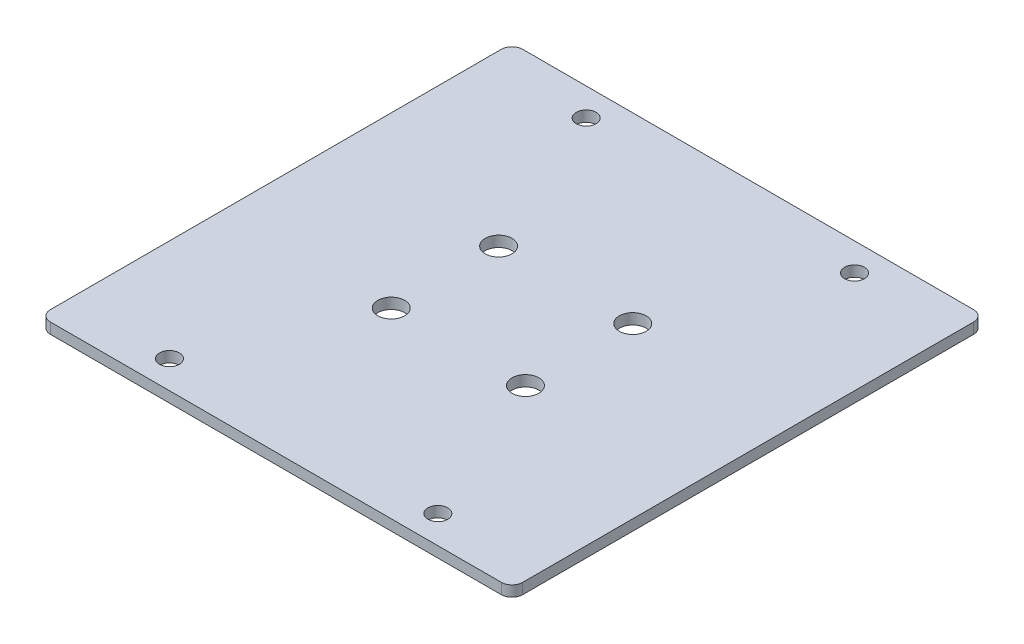
ISO-10303-21;
HEADER;
FILE_DESCRIPTION(('STEP AP214'),'2;1');
FILE_NAME('part.step','',(''),(''),'','','');
FILE_SCHEMA(('AUTOMOTIVE_DESIGN { 1 0 10303 214 1 1 1 1 }'));
ENDSEC;
DATA;
#1=APPLICATION_CONTEXT('core data for automotive mechanical design processes');
#2=APPLICATION_PROTOCOL_DEFINITION('international standard','automotive_design',2000,#1);
#3=PRODUCT_CONTEXT('',#1,'mechanical');
#4=PRODUCT('Part','Part','',(#3));
#5=PRODUCT_RELATED_PRODUCT_CATEGORY('part','',(#4));
#6=PRODUCT_DEFINITION_FORMATION('','',#4);
#7=PRODUCT_DEFINITION_CONTEXT('part definition',#1,'design');
#8=PRODUCT_DEFINITION('design','',#6,#7);
#9=PRODUCT_DEFINITION_SHAPE('','',#8);
#10=(LENGTH_UNIT() NAMED_UNIT(*) SI_UNIT(.MILLI.,.METRE.));
#11=(NAMED_UNIT(*) PLANE_ANGLE_UNIT() SI_UNIT($,.RADIAN.));
#12=(NAMED_UNIT(*) SI_UNIT($,.STERADIAN.) SOLID_ANGLE_UNIT());
#13=UNCERTAINTY_MEASURE_WITH_UNIT(LENGTH_MEASURE(1.E-05),#10,'distance_accuracy_value','');
#14=(GEOMETRIC_REPRESENTATION_CONTEXT(3) GLOBAL_UNCERTAINTY_ASSIGNED_CONTEXT((#13)) GLOBAL_UNIT_ASSIGNED_CONTEXT((#10,
#11,#12)) REPRESENTATION_CONTEXT('',''));
#15=CARTESIAN_POINT('',(0.,0.,0.));
#16=DIRECTION('',(0.,0.,1.));
#17=DIRECTION('',(1.,0.,0.));
#18=AXIS2_PLACEMENT_3D('',#15,#16,#17);
#19=CARTESIAN_POINT('',(-44.,2.,44.));
#20=DIRECTION('',(1.,0.,0.));
#21=DIRECTION('',(0.,0.,-1.));
#22=AXIS2_PLACEMENT_3D('',#19,#20,#21);
#23=PLANE('',#22);
#24=DIRECTION('',(0.,0.,1.));
#25=VECTOR('',#24,1.);
#26=CARTESIAN_POINT('',(-44.,2.,44.));
#27=LINE('',#26,#25);
#28=CARTESIAN_POINT('',(-44.,2.,-42.));
#29=VERTEX_POINT('',#28);
#30=CARTESIAN_POINT('',(-44.,2.,42.));
#31=VERTEX_POINT('',#30);
#32=EDGE_CURVE('E131',#29,#31,#27,.T.);
#33=ORIENTED_EDGE('',*,*,#32,.F.);
#34=DIRECTION('',(0.,-1.,0.));
#35=VECTOR('',#34,1.);
#36=CARTESIAN_POINT('',(-44.,2.,-42.));
#37=LINE('',#36,#35);
#38=CARTESIAN_POINT('',(-44.,0.,-42.));
#39=VERTEX_POINT('',#38);
#40=EDGE_CURVE('E116',#29,#39,#37,.T.);
#41=ORIENTED_EDGE('',*,*,#40,.T.);
#42=DIRECTION('',(0.,0.,1.));
#43=VECTOR('',#42,1.);
#44=CARTESIAN_POINT('',(-44.,0.,44.));
#45=LINE('',#44,#43);
#46=CARTESIAN_POINT('',(-44.,0.,42.));
#47=VERTEX_POINT('',#46);
#48=EDGE_CURVE('E128',#39,#47,#45,.T.);
#49=ORIENTED_EDGE('',*,*,#48,.T.);
#50=DIRECTION('',(0.,-1.,0.));
#51=VECTOR('',#50,1.);
#52=CARTESIAN_POINT('',(-44.,2.,42.));
#53=LINE('',#52,#51);
#54=EDGE_CURVE('E133',#47,#31,#53,.F.);
#55=ORIENTED_EDGE('',*,*,#54,.T.);
#56=EDGE_LOOP('',(#33,#41,#49,#55));
#57=FACE_BOUND('',#56,.T.);
#58=ADVANCED_FACE('F43',(#57),#23,.F.);
#59=CARTESIAN_POINT('',(44.,2.,44.));
#60=DIRECTION('',(0.,0.,-1.));
#61=DIRECTION('',(-1.,0.,0.));
#62=AXIS2_PLACEMENT_3D('',#59,#60,#61);
#63=PLANE('',#62);
#64=DIRECTION('',(1.,0.,0.));
#65=VECTOR('',#64,1.);
#66=CARTESIAN_POINT('',(44.,2.,44.));
#67=LINE('',#66,#65);
#68=CARTESIAN_POINT('',(-42.,2.,44.));
#69=VERTEX_POINT('',#68);
#70=CARTESIAN_POINT('',(42.,2.,44.));
#71=VERTEX_POINT('',#70);
#72=EDGE_CURVE('E212',#69,#71,#67,.T.);
#73=ORIENTED_EDGE('',*,*,#72,.F.);
#74=DIRECTION('',(0.,-1.,0.));
#75=VECTOR('',#74,1.);
#76=CARTESIAN_POINT('',(-42.,2.,44.));
#77=LINE('',#76,#75);
#78=CARTESIAN_POINT('',(-42.,0.,44.));
#79=VERTEX_POINT('',#78);
#80=EDGE_CURVE('E11',#69,#79,#77,.T.);
#81=ORIENTED_EDGE('',*,*,#80,.T.);
#82=DIRECTION('',(1.,0.,0.));
#83=VECTOR('',#82,1.);
#84=CARTESIAN_POINT('',(44.,0.,44.));
#85=LINE('',#84,#83);
#86=CARTESIAN_POINT('',(42.,0.,44.));
#87=VERTEX_POINT('',#86);
#88=EDGE_CURVE('E138',#79,#87,#85,.T.);
#89=ORIENTED_EDGE('',*,*,#88,.T.);
#90=DIRECTION('',(0.,-1.,0.));
#91=VECTOR('',#90,1.);
#92=CARTESIAN_POINT('',(42.,2.,44.));
#93=LINE('',#92,#91);
#94=EDGE_CURVE('E52',#87,#71,#93,.F.);
#95=ORIENTED_EDGE('',*,*,#94,.T.);
#96=EDGE_LOOP('',(#73,#81,#89,#95));
#97=FACE_BOUND('',#96,.T.);
#98=ADVANCED_FACE('F230',(#97),#63,.F.);
#99=CARTESIAN_POINT('',(44.,2.,44.));
#100=DIRECTION('',(-1.,0.,0.));
#101=DIRECTION('',(0.,0.,1.));
#102=AXIS2_PLACEMENT_3D('',#99,#100,#101);
#103=PLANE('',#102);
#104=DIRECTION('',(0.,0.,-1.));
#105=VECTOR('',#104,1.);
#106=CARTESIAN_POINT('',(44.,0.,44.));
#107=LINE('',#106,#105);
#108=CARTESIAN_POINT('',(44.,0.,42.));
#109=VERTEX_POINT('',#108);
#110=CARTESIAN_POINT('',(44.,0.,-42.));
#111=VERTEX_POINT('',#110);
#112=EDGE_CURVE('E142',#109,#111,#107,.T.);
#113=ORIENTED_EDGE('',*,*,#112,.T.);
#114=DIRECTION('',(0.,-1.,0.));
#115=VECTOR('',#114,1.);
#116=CARTESIAN_POINT('',(44.,2.,-42.));
#117=LINE('',#116,#115);
#118=CARTESIAN_POINT('',(44.,2.,-42.));
#119=VERTEX_POINT('',#118);
#120=EDGE_CURVE('E60',#111,#119,#117,.F.);
#121=ORIENTED_EDGE('',*,*,#120,.T.);
#122=DIRECTION('',(0.,0.,-1.));
#123=VECTOR('',#122,1.);
#124=CARTESIAN_POINT('',(44.,2.,44.));
#125=LINE('',#124,#123);
#126=CARTESIAN_POINT('',(44.,2.,42.));
#127=VERTEX_POINT('',#126);
#128=EDGE_CURVE('E213',#127,#119,#125,.T.);
#129=ORIENTED_EDGE('',*,*,#128,.F.);
#130=DIRECTION('',(0.,-1.,0.));
#131=VECTOR('',#130,1.);
#132=CARTESIAN_POINT('',(44.,2.,42.));
#133=LINE('',#132,#131);
#134=EDGE_CURVE('E168',#127,#109,#133,.T.);
#135=ORIENTED_EDGE('',*,*,#134,.T.);
#136=EDGE_LOOP('',(#113,#121,#129,#135));
#137=FACE_BOUND('',#136,.T.);
#138=ADVANCED_FACE('F224',(#137),#103,.F.);
#139=CARTESIAN_POINT('',(44.,2.,-44.));
#140=DIRECTION('',(0.,0.,1.));
#141=DIRECTION('',(1.,0.,0.));
#142=AXIS2_PLACEMENT_3D('',#139,#140,#141);
#143=PLANE('',#142);
#144=DIRECTION('',(-1.,0.,0.));
#145=VECTOR('',#144,1.);
#146=CARTESIAN_POINT('',(44.,0.,-44.));
#147=LINE('',#146,#145);
#148=CARTESIAN_POINT('',(42.,0.,-44.));
#149=VERTEX_POINT('',#148);
#150=CARTESIAN_POINT('',(-42.,0.,-44.));
#151=VERTEX_POINT('',#150);
#152=EDGE_CURVE('E152',#149,#151,#147,.T.);
#153=ORIENTED_EDGE('',*,*,#152,.T.);
#154=DIRECTION('',(0.,-1.,0.));
#155=VECTOR('',#154,1.);
#156=CARTESIAN_POINT('',(-42.,2.,-44.));
#157=LINE('',#156,#155);
#158=CARTESIAN_POINT('',(-42.,2.,-44.));
#159=VERTEX_POINT('',#158);
#160=EDGE_CURVE('E117',#151,#159,#157,.F.);
#161=ORIENTED_EDGE('',*,*,#160,.T.);
#162=DIRECTION('',(-1.,0.,0.));
#163=VECTOR('',#162,1.);
#164=CARTESIAN_POINT('',(44.,2.,-44.));
#165=LINE('',#164,#163);
#166=CARTESIAN_POINT('',(42.,2.,-44.));
#167=VERTEX_POINT('',#166);
#168=EDGE_CURVE('E148',#167,#159,#165,.T.);
#169=ORIENTED_EDGE('',*,*,#168,.F.);
#170=DIRECTION('',(0.,-1.,0.));
#171=VECTOR('',#170,1.);
#172=CARTESIAN_POINT('',(42.,2.,-44.));
#173=LINE('',#172,#171);
#174=EDGE_CURVE('E122',#167,#149,#173,.T.);
#175=ORIENTED_EDGE('',*,*,#174,.T.);
#176=EDGE_LOOP('',(#153,#161,#169,#175));
#177=FACE_BOUND('',#176,.T.);
#178=ADVANCED_FACE('F220',(#177),#143,.F.);
#179=CARTESIAN_POINT('',(0.,2.,0.));
#180=DIRECTION('',(0.,1.,0.));
#181=DIRECTION('',(0.,0.,1.));
#182=AXIS2_PLACEMENT_3D('',#179,#180,#181);
#183=PLANE('',#182);
#184=CARTESIAN_POINT('',(12.5,2.,-10.));
#185=DIRECTION('',(0.,1.,0.));
#186=DIRECTION('',(0.,0.,1.));
#187=AXIS2_PLACEMENT_3D('',#184,#185,#186);
#188=CIRCLE('',#187,2.5);
#189=CARTESIAN_POINT('',(12.5,2.,-7.5));
#190=VERTEX_POINT('',#189);
#191=EDGE_CURVE('E410',#190,#190,#188,.T.);
#192=ORIENTED_EDGE('',*,*,#191,.F.);
#193=EDGE_LOOP('',(#192));
#194=FACE_BOUND('',#193,.T.);
#195=CARTESIAN_POINT('',(12.5,2.,10.));
#196=DIRECTION('',(0.,1.,0.));
#197=DIRECTION('',(0.,0.,1.));
#198=AXIS2_PLACEMENT_3D('',#195,#196,#197);
#199=CIRCLE('',#198,2.5);
#200=CARTESIAN_POINT('',(12.5,2.,12.5));
#201=VERTEX_POINT('',#200);
#202=EDGE_CURVE('E411',#201,#201,#199,.T.);
#203=ORIENTED_EDGE('',*,*,#202,.F.);
#204=EDGE_LOOP('',(#203));
#205=FACE_BOUND('',#204,.T.);
#206=CARTESIAN_POINT('',(-12.5,2.,10.));
#207=DIRECTION('',(0.,1.,0.));
#208=DIRECTION('',(0.,0.,1.));
#209=AXIS2_PLACEMENT_3D('',#206,#207,#208);
#210=CIRCLE('',#209,2.5);
#211=CARTESIAN_POINT('',(-12.5,2.,12.5));
#212=VERTEX_POINT('',#211);
#213=EDGE_CURVE('E413',#212,#212,#210,.T.);
#214=ORIENTED_EDGE('',*,*,#213,.F.);
#215=EDGE_LOOP('',(#214));
#216=FACE_BOUND('',#215,.T.);
#217=CARTESIAN_POINT('',(-12.5,2.,-10.));
#218=DIRECTION('',(0.,1.,0.));
#219=DIRECTION('',(0.,0.,1.));
#220=AXIS2_PLACEMENT_3D('',#217,#218,#219);
#221=CIRCLE('',#220,2.5);
#222=CARTESIAN_POINT('',(-12.5,2.,-7.5));
#223=VERTEX_POINT('',#222);
#224=EDGE_CURVE('E186',#223,#223,#221,.T.);
#225=ORIENTED_EDGE('',*,*,#224,.F.);
#226=EDGE_LOOP('',(#225));
#227=FACE_BOUND('',#226,.T.);
#228=CARTESIAN_POINT('',(25.,2.,-38.82));
#229=DIRECTION('',(0.,1.,0.));
#230=DIRECTION('',(0.,0.,1.));
#231=AXIS2_PLACEMENT_3D('',#228,#229,#230);
#232=CIRCLE('',#231,1.85);
#233=CARTESIAN_POINT('',(25.,2.,-36.97));
#234=VERTEX_POINT('',#233);
#235=EDGE_CURVE('E202',#234,#234,#232,.T.);
#236=ORIENTED_EDGE('',*,*,#235,.F.);
#237=EDGE_LOOP('',(#236));
#238=FACE_BOUND('',#237,.T.);
#239=CARTESIAN_POINT('',(-25.,2.,38.82));
#240=DIRECTION('',(0.,1.,0.));
#241=DIRECTION('',(0.,0.,1.));
#242=AXIS2_PLACEMENT_3D('',#239,#240,#241);
#243=CIRCLE('',#242,1.85);
#244=CARTESIAN_POINT('',(-25.,2.,40.67));
#245=VERTEX_POINT('',#244);
#246=EDGE_CURVE('E197',#245,#245,#243,.T.);
#247=ORIENTED_EDGE('',*,*,#246,.F.);
#248=EDGE_LOOP('',(#247));
#249=FACE_BOUND('',#248,.T.);
#250=CARTESIAN_POINT('',(25.,2.,38.82));
#251=DIRECTION('',(0.,1.,0.));
#252=DIRECTION('',(0.,0.,1.));
#253=AXIS2_PLACEMENT_3D('',#250,#251,#252);
#254=CIRCLE('',#253,1.85);
#255=CARTESIAN_POINT('',(25.,2.,40.67));
#256=VERTEX_POINT('',#255);
#257=EDGE_CURVE('E193',#256,#256,#254,.T.);
#258=ORIENTED_EDGE('',*,*,#257,.F.);
#259=EDGE_LOOP('',(#258));
#260=FACE_BOUND('',#259,.T.);
#261=CARTESIAN_POINT('',(-25.,2.,-38.82));
#262=DIRECTION('',(0.,1.,0.));
#263=DIRECTION('',(0.,0.,1.));
#264=AXIS2_PLACEMENT_3D('',#261,#262,#263);
#265=CIRCLE('',#264,1.85);
#266=CARTESIAN_POINT('',(-25.,2.,-36.97));
#267=VERTEX_POINT('',#266);
#268=EDGE_CURVE('E177',#267,#267,#265,.T.);
#269=ORIENTED_EDGE('',*,*,#268,.F.);
#270=EDGE_LOOP('',(#269));
#271=FACE_BOUND('',#270,.T.);
#272=ORIENTED_EDGE('',*,*,#168,.T.);
#273=CARTESIAN_POINT('',(-42.,2.,-42.));
#274=DIRECTION('',(0.,1.,0.));
#275=DIRECTION('',(0.,0.,1.));
#276=AXIS2_PLACEMENT_3D('',#273,#274,#275);
#277=CIRCLE('',#276,2.);
#278=EDGE_CURVE('E166',#159,#29,#277,.T.);
#279=ORIENTED_EDGE('',*,*,#278,.T.);
#280=ORIENTED_EDGE('',*,*,#32,.T.);
#281=CARTESIAN_POINT('',(-42.,2.,42.));
#282=DIRECTION('',(0.,1.,0.));
#283=DIRECTION('',(0.,0.,1.));
#284=AXIS2_PLACEMENT_3D('',#281,#282,#283);
#285=CIRCLE('',#284,2.);
#286=EDGE_CURVE('E162',#31,#69,#285,.T.);
#287=ORIENTED_EDGE('',*,*,#286,.T.);
#288=ORIENTED_EDGE('',*,*,#72,.T.);
#289=CARTESIAN_POINT('',(42.,2.,42.));
#290=DIRECTION('',(0.,1.,0.));
#291=DIRECTION('',(0.,0.,1.));
#292=AXIS2_PLACEMENT_3D('',#289,#290,#291);
#293=CIRCLE('',#292,2.);
#294=EDGE_CURVE('E67',#71,#127,#293,.T.);
#295=ORIENTED_EDGE('',*,*,#294,.T.);
#296=ORIENTED_EDGE('',*,*,#128,.T.);
#297=CARTESIAN_POINT('',(42.,2.,-42.));
#298=DIRECTION('',(0.,1.,0.));
#299=DIRECTION('',(0.,0.,1.));
#300=AXIS2_PLACEMENT_3D('',#297,#298,#299);
#301=CIRCLE('',#300,2.);
#302=EDGE_CURVE('E164',#119,#167,#301,.T.);
#303=ORIENTED_EDGE('',*,*,#302,.T.);
#304=EDGE_LOOP('',(#272,#279,#280,#287,#288,#295,#296,#303));
#305=FACE_BOUND('',#304,.T.);
#306=ADVANCED_FACE('F217',(#194,#205,#216,#227,#238,#249,#260,#271,#305),#183,.T.);
#307=CARTESIAN_POINT('',(0.,0.,0.));
#308=DIRECTION('',(0.,1.,0.));
#309=DIRECTION('',(0.,0.,1.));
#310=AXIS2_PLACEMENT_3D('',#307,#308,#309);
#311=PLANE('',#310);
#312=CARTESIAN_POINT('',(12.5,0.,-10.));
#313=DIRECTION('',(0.,1.,0.));
#314=DIRECTION('',(0.,0.,1.));
#315=AXIS2_PLACEMENT_3D('',#312,#313,#314);
#316=CIRCLE('',#315,2.5);
#317=CARTESIAN_POINT('',(12.5,0.,-7.5));
#318=VERTEX_POINT('',#317);
#319=EDGE_CURVE('E47',#318,#318,#316,.T.);
#320=ORIENTED_EDGE('',*,*,#319,.T.);
#321=EDGE_LOOP('',(#320));
#322=FACE_BOUND('',#321,.T.);
#323=CARTESIAN_POINT('',(12.5,0.,10.));
#324=DIRECTION('',(0.,1.,0.));
#325=DIRECTION('',(0.,0.,1.));
#326=AXIS2_PLACEMENT_3D('',#323,#324,#325);
#327=CIRCLE('',#326,2.5);
#328=CARTESIAN_POINT('',(12.5,0.,12.5));
#329=VERTEX_POINT('',#328);
#330=EDGE_CURVE('E188',#329,#329,#327,.T.);
#331=ORIENTED_EDGE('',*,*,#330,.T.);
#332=EDGE_LOOP('',(#331));
#333=FACE_BOUND('',#332,.T.);
#334=CARTESIAN_POINT('',(-12.5,0.,10.));
#335=DIRECTION('',(0.,1.,0.));
#336=DIRECTION('',(0.,0.,1.));
#337=AXIS2_PLACEMENT_3D('',#334,#335,#336);
#338=CIRCLE('',#337,2.5);
#339=CARTESIAN_POINT('',(-12.5,0.,12.5));
#340=VERTEX_POINT('',#339);
#341=EDGE_CURVE('E185',#340,#340,#338,.T.);
#342=ORIENTED_EDGE('',*,*,#341,.T.);
#343=EDGE_LOOP('',(#342));
#344=FACE_BOUND('',#343,.T.);
#345=CARTESIAN_POINT('',(-12.5,0.,-10.));
#346=DIRECTION('',(0.,1.,0.));
#347=DIRECTION('',(0.,0.,1.));
#348=AXIS2_PLACEMENT_3D('',#345,#346,#347);
#349=CIRCLE('',#348,2.5);
#350=CARTESIAN_POINT('',(-12.5,0.,-7.5));
#351=VERTEX_POINT('',#350);
#352=EDGE_CURVE('E182',#351,#351,#349,.T.);
#353=ORIENTED_EDGE('',*,*,#352,.T.);
#354=EDGE_LOOP('',(#353));
#355=FACE_BOUND('',#354,.T.);
#356=CARTESIAN_POINT('',(25.,0.,-38.82));
#357=DIRECTION('',(0.,1.,0.));
#358=DIRECTION('',(0.,0.,1.));
#359=AXIS2_PLACEMENT_3D('',#356,#357,#358);
#360=CIRCLE('',#359,1.85);
#361=CARTESIAN_POINT('',(25.,0.,-36.97));
#362=VERTEX_POINT('',#361);
#363=EDGE_CURVE('E139',#362,#362,#360,.T.);
#364=ORIENTED_EDGE('',*,*,#363,.T.);
#365=EDGE_LOOP('',(#364));
#366=FACE_BOUND('',#365,.T.);
#367=CARTESIAN_POINT('',(-25.,0.,38.82));
#368=DIRECTION('',(0.,1.,0.));
#369=DIRECTION('',(0.,0.,1.));
#370=AXIS2_PLACEMENT_3D('',#367,#368,#369);
#371=CIRCLE('',#370,1.85);
#372=CARTESIAN_POINT('',(-25.,0.,40.67));
#373=VERTEX_POINT('',#372);
#374=EDGE_CURVE('E145',#373,#373,#371,.T.);
#375=ORIENTED_EDGE('',*,*,#374,.T.);
#376=EDGE_LOOP('',(#375));
#377=FACE_BOUND('',#376,.T.);
#378=CARTESIAN_POINT('',(25.,0.,38.82));
#379=DIRECTION('',(0.,1.,0.));
#380=DIRECTION('',(0.,0.,1.));
#381=AXIS2_PLACEMENT_3D('',#378,#379,#380);
#382=CIRCLE('',#381,1.85);
#383=CARTESIAN_POINT('',(25.,0.,40.67));
#384=VERTEX_POINT('',#383);
#385=EDGE_CURVE('E176',#384,#384,#382,.T.);
#386=ORIENTED_EDGE('',*,*,#385,.T.);
#387=EDGE_LOOP('',(#386));
#388=FACE_BOUND('',#387,.T.);
#389=CARTESIAN_POINT('',(-25.,0.,-38.82));
#390=DIRECTION('',(0.,1.,0.));
#391=DIRECTION('',(0.,0.,1.));
#392=AXIS2_PLACEMENT_3D('',#389,#390,#391);
#393=CIRCLE('',#392,1.85);
#394=CARTESIAN_POINT('',(-25.,0.,-36.97));
#395=VERTEX_POINT('',#394);
#396=EDGE_CURVE('E173',#395,#395,#393,.T.);
#397=ORIENTED_EDGE('',*,*,#396,.T.);
#398=EDGE_LOOP('',(#397));
#399=FACE_BOUND('',#398,.T.);
#400=ORIENTED_EDGE('',*,*,#48,.F.);
#401=CARTESIAN_POINT('',(-42.,0.,-42.));
#402=DIRECTION('',(0.,1.,0.));
#403=DIRECTION('',(0.,0.,1.));
#404=AXIS2_PLACEMENT_3D('',#401,#402,#403);
#405=CIRCLE('',#404,2.);
#406=EDGE_CURVE('E112',#39,#151,#405,.F.);
#407=ORIENTED_EDGE('',*,*,#406,.T.);
#408=ORIENTED_EDGE('',*,*,#152,.F.);
#409=CARTESIAN_POINT('',(42.,0.,-42.));
#410=DIRECTION('',(0.,1.,0.));
#411=DIRECTION('',(0.,0.,1.));
#412=AXIS2_PLACEMENT_3D('',#409,#410,#411);
#413=CIRCLE('',#412,2.);
#414=EDGE_CURVE('E123',#149,#111,#413,.F.);
#415=ORIENTED_EDGE('',*,*,#414,.T.);
#416=ORIENTED_EDGE('',*,*,#112,.F.);
#417=CARTESIAN_POINT('',(42.,0.,42.));
#418=DIRECTION('',(0.,1.,0.));
#419=DIRECTION('',(0.,0.,1.));
#420=AXIS2_PLACEMENT_3D('',#417,#418,#419);
#421=CIRCLE('',#420,2.);
#422=EDGE_CURVE('E132',#109,#87,#421,.F.);
#423=ORIENTED_EDGE('',*,*,#422,.T.);
#424=ORIENTED_EDGE('',*,*,#88,.F.);
#425=CARTESIAN_POINT('',(-42.,0.,42.));
#426=DIRECTION('',(0.,1.,0.));
#427=DIRECTION('',(0.,0.,1.));
#428=AXIS2_PLACEMENT_3D('',#425,#426,#427);
#429=CIRCLE('',#428,2.);
#430=EDGE_CURVE('E137',#79,#47,#429,.F.);
#431=ORIENTED_EDGE('',*,*,#430,.T.);
#432=EDGE_LOOP('',(#400,#407,#408,#415,#416,#423,#424,#431));
#433=FACE_BOUND('',#432,.T.);
#434=ADVANCED_FACE('F135',(#322,#333,#344,#355,#366,#377,#388,#399,#433),#311,.F.);
#435=CARTESIAN_POINT('',(-42.,2.,-42.));
#436=DIRECTION('',(0.,-1.,0.));
#437=DIRECTION('',(0.,0.,-1.));
#438=AXIS2_PLACEMENT_3D('',#435,#436,#437);
#439=CYLINDRICAL_SURFACE('',#438,2.);
#440=ORIENTED_EDGE('',*,*,#278,.F.);
#441=ORIENTED_EDGE('',*,*,#160,.F.);
#442=ORIENTED_EDGE('',*,*,#406,.F.);
#443=ORIENTED_EDGE('',*,*,#40,.F.);
#444=EDGE_LOOP('',(#440,#441,#442,#443));
#445=FACE_BOUND('',#444,.T.);
#446=ADVANCED_FACE('F115',(#445),#439,.T.);
#447=CARTESIAN_POINT('',(42.,2.,-42.));
#448=DIRECTION('',(0.,-1.,0.));
#449=DIRECTION('',(0.,0.,-1.));
#450=AXIS2_PLACEMENT_3D('',#447,#448,#449);
#451=CYLINDRICAL_SURFACE('',#450,2.);
#452=ORIENTED_EDGE('',*,*,#302,.F.);
#453=ORIENTED_EDGE('',*,*,#120,.F.);
#454=ORIENTED_EDGE('',*,*,#414,.F.);
#455=ORIENTED_EDGE('',*,*,#174,.F.);
#456=EDGE_LOOP('',(#452,#453,#454,#455));
#457=FACE_BOUND('',#456,.T.);
#458=ADVANCED_FACE('F222',(#457),#451,.T.);
#459=CARTESIAN_POINT('',(-42.,2.,42.));
#460=DIRECTION('',(0.,-1.,0.));
#461=DIRECTION('',(0.,0.,-1.));
#462=AXIS2_PLACEMENT_3D('',#459,#460,#461);
#463=CYLINDRICAL_SURFACE('',#462,2.);
#464=ORIENTED_EDGE('',*,*,#286,.F.);
#465=ORIENTED_EDGE('',*,*,#54,.F.);
#466=ORIENTED_EDGE('',*,*,#430,.F.);
#467=ORIENTED_EDGE('',*,*,#80,.F.);
#468=EDGE_LOOP('',(#464,#465,#466,#467));
#469=FACE_BOUND('',#468,.T.);
#470=ADVANCED_FACE('F234',(#469),#463,.T.);
#471=CARTESIAN_POINT('',(42.,2.,42.));
#472=DIRECTION('',(0.,-1.,0.));
#473=DIRECTION('',(0.,0.,-1.));
#474=AXIS2_PLACEMENT_3D('',#471,#472,#473);
#475=CYLINDRICAL_SURFACE('',#474,2.);
#476=ORIENTED_EDGE('',*,*,#294,.F.);
#477=ORIENTED_EDGE('',*,*,#94,.F.);
#478=ORIENTED_EDGE('',*,*,#422,.F.);
#479=ORIENTED_EDGE('',*,*,#134,.F.);
#480=EDGE_LOOP('',(#476,#477,#478,#479));
#481=FACE_BOUND('',#480,.T.);
#482=ADVANCED_FACE('F45',(#481),#475,.T.);
#483=CARTESIAN_POINT('',(-25.,-8.,-38.82));
#484=DIRECTION('',(0.,1.,0.));
#485=DIRECTION('',(0.,0.,1.));
#486=AXIS2_PLACEMENT_3D('',#483,#484,#485);
#487=CYLINDRICAL_SURFACE('',#486,1.85);
#488=ORIENTED_EDGE('',*,*,#268,.T.);
#489=EDGE_LOOP('',(#488));
#490=FACE_BOUND('',#489,.T.);
#491=ORIENTED_EDGE('',*,*,#396,.F.);
#492=EDGE_LOOP('',(#491));
#493=FACE_BOUND('',#492,.T.);
#494=ADVANCED_FACE('F240',(#490,#493),#487,.F.);
#495=CARTESIAN_POINT('',(25.,-8.,38.82));
#496=DIRECTION('',(0.,1.,0.));
#497=DIRECTION('',(0.,0.,1.));
#498=AXIS2_PLACEMENT_3D('',#495,#496,#497);
#499=CYLINDRICAL_SURFACE('',#498,1.85);
#500=ORIENTED_EDGE('',*,*,#257,.T.);
#501=EDGE_LOOP('',(#500));
#502=FACE_BOUND('',#501,.T.);
#503=ORIENTED_EDGE('',*,*,#385,.F.);
#504=EDGE_LOOP('',(#503));
#505=FACE_BOUND('',#504,.T.);
#506=ADVANCED_FACE('F322',(#502,#505),#499,.F.);
#507=CARTESIAN_POINT('',(-25.,-8.,38.82));
#508=DIRECTION('',(0.,1.,0.));
#509=DIRECTION('',(0.,0.,1.));
#510=AXIS2_PLACEMENT_3D('',#507,#508,#509);
#511=CYLINDRICAL_SURFACE('',#510,1.85);
#512=ORIENTED_EDGE('',*,*,#246,.T.);
#513=EDGE_LOOP('',(#512));
#514=FACE_BOUND('',#513,.T.);
#515=ORIENTED_EDGE('',*,*,#374,.F.);
#516=EDGE_LOOP('',(#515));
#517=FACE_BOUND('',#516,.T.);
#518=ADVANCED_FACE('F332',(#514,#517),#511,.F.);
#519=CARTESIAN_POINT('',(25.,-8.,-38.82));
#520=DIRECTION('',(0.,1.,0.));
#521=DIRECTION('',(0.,0.,1.));
#522=AXIS2_PLACEMENT_3D('',#519,#520,#521);
#523=CYLINDRICAL_SURFACE('',#522,1.85);
#524=ORIENTED_EDGE('',*,*,#235,.T.);
#525=EDGE_LOOP('',(#524));
#526=FACE_BOUND('',#525,.T.);
#527=ORIENTED_EDGE('',*,*,#363,.F.);
#528=EDGE_LOOP('',(#527));
#529=FACE_BOUND('',#528,.T.);
#530=ADVANCED_FACE('F342',(#526,#529),#523,.F.);
#531=CARTESIAN_POINT('',(-12.5,-8.,-10.));
#532=DIRECTION('',(0.,1.,0.));
#533=DIRECTION('',(0.,0.,1.));
#534=AXIS2_PLACEMENT_3D('',#531,#532,#533);
#535=CYLINDRICAL_SURFACE('',#534,2.5);
#536=ORIENTED_EDGE('',*,*,#224,.T.);
#537=EDGE_LOOP('',(#536));
#538=FACE_BOUND('',#537,.T.);
#539=ORIENTED_EDGE('',*,*,#352,.F.);
#540=EDGE_LOOP('',(#539));
#541=FACE_BOUND('',#540,.T.);
#542=ADVANCED_FACE('F352',(#538,#541),#535,.F.);
#543=CARTESIAN_POINT('',(-12.5,-8.,10.));
#544=DIRECTION('',(0.,1.,0.));
#545=DIRECTION('',(0.,0.,1.));
#546=AXIS2_PLACEMENT_3D('',#543,#544,#545);
#547=CYLINDRICAL_SURFACE('',#546,2.5);
#548=ORIENTED_EDGE('',*,*,#213,.T.);
#549=EDGE_LOOP('',(#548));
#550=FACE_BOUND('',#549,.T.);
#551=ORIENTED_EDGE('',*,*,#341,.F.);
#552=EDGE_LOOP('',(#551));
#553=FACE_BOUND('',#552,.T.);
#554=ADVANCED_FACE('F362',(#550,#553),#547,.F.);
#555=CARTESIAN_POINT('',(12.5,-8.,10.));
#556=DIRECTION('',(0.,1.,0.));
#557=DIRECTION('',(0.,0.,1.));
#558=AXIS2_PLACEMENT_3D('',#555,#556,#557);
#559=CYLINDRICAL_SURFACE('',#558,2.5);
#560=ORIENTED_EDGE('',*,*,#202,.T.);
#561=EDGE_LOOP('',(#560));
#562=FACE_BOUND('',#561,.T.);
#563=ORIENTED_EDGE('',*,*,#330,.F.);
#564=EDGE_LOOP('',(#563));
#565=FACE_BOUND('',#564,.T.);
#566=ADVANCED_FACE('F373',(#562,#565),#559,.F.);
#567=CARTESIAN_POINT('',(12.5,-8.,-10.));
#568=DIRECTION('',(0.,1.,0.));
#569=DIRECTION('',(0.,0.,1.));
#570=AXIS2_PLACEMENT_3D('',#567,#568,#569);
#571=CYLINDRICAL_SURFACE('',#570,2.5);
#572=ORIENTED_EDGE('',*,*,#191,.T.);
#573=EDGE_LOOP('',(#572));
#574=FACE_BOUND('',#573,.T.);
#575=ORIENTED_EDGE('',*,*,#319,.F.);
#576=EDGE_LOOP('',(#575));
#577=FACE_BOUND('',#576,.T.);
#578=ADVANCED_FACE('F384',(#574,#577),#571,.F.);
#579=CLOSED_SHELL('',(#58,#98,#138,#178,#306,#434,#446,#458,#470,#482,#494,#506,#518,#530,#542,
#554,#566,#578));
#580=MANIFOLD_SOLID_BREP('B2',#579);
#581=ADVANCED_BREP_SHAPE_REPRESENTATION('',(#18,#580),#14);
#582=SHAPE_DEFINITION_REPRESENTATION(#9,#581);
ENDSEC;
END-ISO-10303-21;
